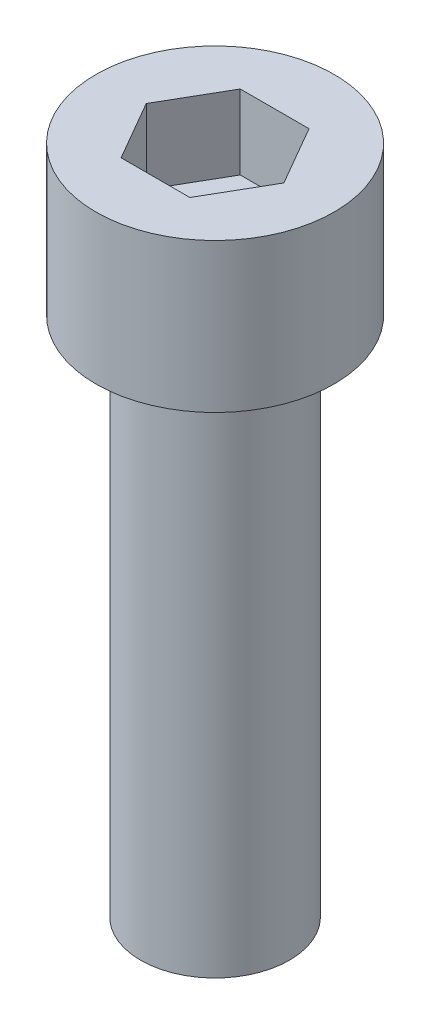
ISO-10303-21;
HEADER;
FILE_DESCRIPTION(('STEP AP214'),'2;1');
FILE_NAME('part.step','',(''),(''),'','','');
FILE_SCHEMA(('AUTOMOTIVE_DESIGN { 1 0 10303 214 1 1 1 1 }'));
ENDSEC;
DATA;
#1=APPLICATION_CONTEXT('core data for automotive mechanical design processes');
#2=APPLICATION_PROTOCOL_DEFINITION('international standard','automotive_design',2000,#1);
#3=PRODUCT_CONTEXT('',#1,'mechanical');
#4=PRODUCT('Part','Part','',(#3));
#5=PRODUCT_RELATED_PRODUCT_CATEGORY('part','',(#4));
#6=PRODUCT_DEFINITION_FORMATION('','',#4);
#7=PRODUCT_DEFINITION_CONTEXT('part definition',#1,'design');
#8=PRODUCT_DEFINITION('design','',#6,#7);
#9=PRODUCT_DEFINITION_SHAPE('','',#8);
#10=(LENGTH_UNIT() NAMED_UNIT(*) SI_UNIT(.MILLI.,.METRE.));
#11=(NAMED_UNIT(*) PLANE_ANGLE_UNIT() SI_UNIT($,.RADIAN.));
#12=(NAMED_UNIT(*) SI_UNIT($,.STERADIAN.) SOLID_ANGLE_UNIT());
#13=UNCERTAINTY_MEASURE_WITH_UNIT(LENGTH_MEASURE(1.E-05),#10,'distance_accuracy_value','');
#14=(GEOMETRIC_REPRESENTATION_CONTEXT(3) GLOBAL_UNCERTAINTY_ASSIGNED_CONTEXT((#13)) GLOBAL_UNIT_ASSIGNED_CONTEXT((#10,
#11,#12)) REPRESENTATION_CONTEXT('',''));
#15=CARTESIAN_POINT('',(0.,0.,0.));
#16=DIRECTION('',(0.,0.,1.));
#17=DIRECTION('',(1.,0.,0.));
#18=AXIS2_PLACEMENT_3D('',#15,#16,#17);
#19=CARTESIAN_POINT('',(8.00000000000001,10.,0.));
#20=DIRECTION('',(0.,-1.,0.));
#21=DIRECTION('',(0.,0.,-1.));
#22=AXIS2_PLACEMENT_3D('',#19,#20,#21);
#23=PLANE('',#22);
#24=DIRECTION('',(-1.,0.,0.));
#25=VECTOR('',#24,1.);
#26=CARTESIAN_POINT('',(2.3094010767585,10.,-4.));
#27=LINE('',#26,#25);
#28=CARTESIAN_POINT('',(2.3094010767585,10.,-4.));
#29=VERTEX_POINT('',#28);
#30=CARTESIAN_POINT('',(-2.3094010767585,10.,-4.));
#31=VERTEX_POINT('',#30);
#32=EDGE_CURVE('E122',#29,#31,#27,.T.);
#33=ORIENTED_EDGE('',*,*,#32,.F.);
#34=DIRECTION('',(-0.5,0.,-0.866025403784439));
#35=VECTOR('',#34,1.);
#36=CARTESIAN_POINT('',(4.61880215351701,10.,0.));
#37=LINE('',#36,#35);
#38=CARTESIAN_POINT('',(4.61880215351701,10.,0.));
#39=VERTEX_POINT('',#38);
#40=EDGE_CURVE('E48',#39,#29,#37,.T.);
#41=ORIENTED_EDGE('',*,*,#40,.F.);
#42=DIRECTION('',(0.5,0.,-0.866025403784439));
#43=VECTOR('',#42,1.);
#44=CARTESIAN_POINT('',(2.3094010767585,10.,4.));
#45=LINE('',#44,#43);
#46=CARTESIAN_POINT('',(2.3094010767585,10.,4.));
#47=VERTEX_POINT('',#46);
#48=EDGE_CURVE('E131',#47,#39,#45,.T.);
#49=ORIENTED_EDGE('',*,*,#48,.F.);
#50=DIRECTION('',(1.,0.,0.));
#51=VECTOR('',#50,1.);
#52=CARTESIAN_POINT('',(-2.3094010767585,10.,4.));
#53=LINE('',#52,#51);
#54=CARTESIAN_POINT('',(-2.3094010767585,10.,4.));
#55=VERTEX_POINT('',#54);
#56=EDGE_CURVE('E129',#55,#47,#53,.T.);
#57=ORIENTED_EDGE('',*,*,#56,.F.);
#58=DIRECTION('',(0.5,0.,0.866025403784438));
#59=VECTOR('',#58,1.);
#60=CARTESIAN_POINT('',(-4.61880215351701,10.,0.));
#61=LINE('',#60,#59);
#62=CARTESIAN_POINT('',(-4.61880215351701,10.,0.));
#63=VERTEX_POINT('',#62);
#64=EDGE_CURVE('E96',#63,#55,#61,.T.);
#65=ORIENTED_EDGE('',*,*,#64,.F.);
#66=DIRECTION('',(-0.5,0.,0.866025403784439));
#67=VECTOR('',#66,1.);
#68=CARTESIAN_POINT('',(-2.3094010767585,10.,-4.));
#69=LINE('',#68,#67);
#70=EDGE_CURVE('E125',#31,#63,#69,.T.);
#71=ORIENTED_EDGE('',*,*,#70,.F.);
#72=EDGE_LOOP('',(#33,#41,#49,#57,#65,#71));
#73=FACE_BOUND('',#72,.T.);
#74=CARTESIAN_POINT('',(0.,10.,0.));
#75=DIRECTION('',(0.,1.,0.));
#76=DIRECTION('',(0.,0.,1.));
#77=AXIS2_PLACEMENT_3D('',#74,#75,#76);
#78=CIRCLE('',#77,8.00000000000001);
#79=CARTESIAN_POINT('',(0.,10.,8.00000000000001));
#80=VERTEX_POINT('',#79);
#81=EDGE_CURVE('E11',#80,#80,#78,.T.);
#82=ORIENTED_EDGE('',*,*,#81,.T.);
#83=EDGE_LOOP('',(#82));
#84=FACE_BOUND('',#83,.T.);
#85=ADVANCED_FACE('F34',(#73,#84),#23,.F.);
#86=CARTESIAN_POINT('',(0.,61.6916426261037,0.));
#87=DIRECTION('',(0.,1.,0.));
#88=DIRECTION('',(0.,0.,1.));
#89=AXIS2_PLACEMENT_3D('',#86,#87,#88);
#90=CYLINDRICAL_SURFACE('',#89,8.00000000000001);
#91=ORIENTED_EDGE('',*,*,#81,.F.);
#92=EDGE_LOOP('',(#91));
#93=FACE_BOUND('',#92,.T.);
#94=CARTESIAN_POINT('',(0.,0.,0.));
#95=DIRECTION('',(0.,1.,0.));
#96=DIRECTION('',(0.,0.,1.));
#97=AXIS2_PLACEMENT_3D('',#94,#95,#96);
#98=CIRCLE('',#97,8.00000000000001);
#99=CARTESIAN_POINT('',(0.,0.,8.00000000000001));
#100=VERTEX_POINT('',#99);
#101=EDGE_CURVE('E41',#100,#100,#98,.T.);
#102=ORIENTED_EDGE('',*,*,#101,.T.);
#103=EDGE_LOOP('',(#102));
#104=FACE_BOUND('',#103,.T.);
#105=ADVANCED_FACE('F148',(#93,#104),#90,.T.);
#106=CARTESIAN_POINT('',(5.00000000000001,0.,0.));
#107=DIRECTION('',(0.,1.,0.));
#108=DIRECTION('',(0.,0.,1.));
#109=AXIS2_PLACEMENT_3D('',#106,#107,#108);
#110=PLANE('',#109);
#111=ORIENTED_EDGE('',*,*,#101,.F.);
#112=EDGE_LOOP('',(#111));
#113=FACE_BOUND('',#112,.T.);
#114=CARTESIAN_POINT('',(0.,0.,0.));
#115=DIRECTION('',(0.,1.,0.));
#116=DIRECTION('',(0.,0.,1.));
#117=AXIS2_PLACEMENT_3D('',#114,#115,#116);
#118=CIRCLE('',#117,5.00000000000001);
#119=CARTESIAN_POINT('',(0.,0.,5.00000000000001));
#120=VERTEX_POINT('',#119);
#121=EDGE_CURVE('E143',#120,#120,#118,.T.);
#122=ORIENTED_EDGE('',*,*,#121,.T.);
#123=EDGE_LOOP('',(#122));
#124=FACE_BOUND('',#123,.T.);
#125=ADVANCED_FACE('F150',(#113,#124),#110,.F.);
#126=CARTESIAN_POINT('',(0.,61.6916426261037,0.));
#127=DIRECTION('',(0.,1.,0.));
#128=DIRECTION('',(0.,0.,1.));
#129=AXIS2_PLACEMENT_3D('',#126,#127,#128);
#130=CYLINDRICAL_SURFACE('',#129,5.00000000000001);
#131=ORIENTED_EDGE('',*,*,#121,.F.);
#132=EDGE_LOOP('',(#131));
#133=FACE_BOUND('',#132,.T.);
#134=CARTESIAN_POINT('',(0.,-35.,0.));
#135=DIRECTION('',(0.,1.,0.));
#136=DIRECTION('',(0.,0.,1.));
#137=AXIS2_PLACEMENT_3D('',#134,#135,#136);
#138=CIRCLE('',#137,5.00000000000001);
#139=CARTESIAN_POINT('',(0.,-35.,5.00000000000001));
#140=VERTEX_POINT('',#139);
#141=EDGE_CURVE('E135',#140,#140,#138,.T.);
#142=ORIENTED_EDGE('',*,*,#141,.T.);
#143=EDGE_LOOP('',(#142));
#144=FACE_BOUND('',#143,.T.);
#145=ADVANCED_FACE('F153',(#133,#144),#130,.T.);
#146=CARTESIAN_POINT('',(0.,-35.,0.));
#147=DIRECTION('',(0.,1.,0.));
#148=DIRECTION('',(0.,0.,1.));
#149=AXIS2_PLACEMENT_3D('',#146,#147,#148);
#150=PLANE('',#149);
#151=ORIENTED_EDGE('',*,*,#141,.F.);
#152=EDGE_LOOP('',(#151));
#153=FACE_BOUND('',#152,.T.);
#154=ADVANCED_FACE('F159',(#153),#150,.F.);
#155=CARTESIAN_POINT('',(4.61880215351701,5.,0.));
#156=DIRECTION('',(0.866025403784439,0.,-0.5));
#157=DIRECTION('',(-0.5,0.,-0.866025403784439));
#158=AXIS2_PLACEMENT_3D('',#155,#156,#157);
#159=PLANE('',#158);
#160=ORIENTED_EDGE('',*,*,#40,.T.);
#161=DIRECTION('',(0.,1.,0.));
#162=VECTOR('',#161,1.);
#163=CARTESIAN_POINT('',(2.3094010767585,5.,-4.));
#164=LINE('',#163,#162);
#165=CARTESIAN_POINT('',(2.3094010767585,5.,-4.));
#166=VERTEX_POINT('',#165);
#167=EDGE_CURVE('E78',#166,#29,#164,.T.);
#168=ORIENTED_EDGE('',*,*,#167,.F.);
#169=DIRECTION('',(-0.5,0.,-0.866025403784439));
#170=VECTOR('',#169,1.);
#171=CARTESIAN_POINT('',(4.61880215351701,5.,0.));
#172=LINE('',#171,#170);
#173=CARTESIAN_POINT('',(4.61880215351701,5.,0.));
#174=VERTEX_POINT('',#173);
#175=EDGE_CURVE('E133',#174,#166,#172,.T.);
#176=ORIENTED_EDGE('',*,*,#175,.F.);
#177=DIRECTION('',(0.,1.,0.));
#178=VECTOR('',#177,1.);
#179=CARTESIAN_POINT('',(4.61880215351701,5.,0.));
#180=LINE('',#179,#178);
#181=EDGE_CURVE('E56',#174,#39,#180,.T.);
#182=ORIENTED_EDGE('',*,*,#181,.T.);
#183=EDGE_LOOP('',(#160,#168,#176,#182));
#184=FACE_BOUND('',#183,.T.);
#185=ADVANCED_FACE('F164',(#184),#159,.F.);
#186=CARTESIAN_POINT('',(2.3094010767585,5.,4.));
#187=DIRECTION('',(0.866025403784439,0.,0.5));
#188=DIRECTION('',(0.5,0.,-0.866025403784439));
#189=AXIS2_PLACEMENT_3D('',#186,#187,#188);
#190=PLANE('',#189);
#191=ORIENTED_EDGE('',*,*,#48,.T.);
#192=ORIENTED_EDGE('',*,*,#181,.F.);
#193=DIRECTION('',(0.5,0.,-0.866025403784439));
#194=VECTOR('',#193,1.);
#195=CARTESIAN_POINT('',(2.3094010767585,5.,4.));
#196=LINE('',#195,#194);
#197=CARTESIAN_POINT('',(2.3094010767585,5.,4.));
#198=VERTEX_POINT('',#197);
#199=EDGE_CURVE('E108',#198,#174,#196,.T.);
#200=ORIENTED_EDGE('',*,*,#199,.F.);
#201=DIRECTION('',(0.,1.,0.));
#202=VECTOR('',#201,1.);
#203=CARTESIAN_POINT('',(2.3094010767585,5.,4.));
#204=LINE('',#203,#202);
#205=EDGE_CURVE('E100',#198,#47,#204,.T.);
#206=ORIENTED_EDGE('',*,*,#205,.T.);
#207=EDGE_LOOP('',(#191,#192,#200,#206));
#208=FACE_BOUND('',#207,.T.);
#209=ADVANCED_FACE('F169',(#208),#190,.F.);
#210=CARTESIAN_POINT('',(-2.3094010767585,5.,4.));
#211=DIRECTION('',(0.,0.,1.));
#212=DIRECTION('',(1.,0.,0.));
#213=AXIS2_PLACEMENT_3D('',#210,#211,#212);
#214=PLANE('',#213);
#215=ORIENTED_EDGE('',*,*,#56,.T.);
#216=ORIENTED_EDGE('',*,*,#205,.F.);
#217=DIRECTION('',(1.,0.,0.));
#218=VECTOR('',#217,1.);
#219=CARTESIAN_POINT('',(-2.3094010767585,5.,4.));
#220=LINE('',#219,#218);
#221=CARTESIAN_POINT('',(-2.3094010767585,5.,4.));
#222=VERTEX_POINT('',#221);
#223=EDGE_CURVE('E104',#222,#198,#220,.T.);
#224=ORIENTED_EDGE('',*,*,#223,.F.);
#225=DIRECTION('',(0.,1.,0.));
#226=VECTOR('',#225,1.);
#227=CARTESIAN_POINT('',(-2.3094010767585,5.,4.));
#228=LINE('',#227,#226);
#229=EDGE_CURVE('E89',#222,#55,#228,.T.);
#230=ORIENTED_EDGE('',*,*,#229,.T.);
#231=EDGE_LOOP('',(#215,#216,#224,#230));
#232=FACE_BOUND('',#231,.T.);
#233=ADVANCED_FACE('F105',(#232),#214,.F.);
#234=CARTESIAN_POINT('',(-4.61880215351701,5.,0.));
#235=DIRECTION('',(-0.866025403784438,0.,0.5));
#236=DIRECTION('',(0.5,0.,0.866025403784439));
#237=AXIS2_PLACEMENT_3D('',#234,#235,#236);
#238=PLANE('',#237);
#239=ORIENTED_EDGE('',*,*,#64,.T.);
#240=ORIENTED_EDGE('',*,*,#229,.F.);
#241=DIRECTION('',(0.5,0.,0.866025403784438));
#242=VECTOR('',#241,1.);
#243=CARTESIAN_POINT('',(-4.61880215351701,5.,0.));
#244=LINE('',#243,#242);
#245=CARTESIAN_POINT('',(-4.61880215351701,5.,0.));
#246=VERTEX_POINT('',#245);
#247=EDGE_CURVE('E93',#246,#222,#244,.T.);
#248=ORIENTED_EDGE('',*,*,#247,.F.);
#249=DIRECTION('',(0.,1.,0.));
#250=VECTOR('',#249,1.);
#251=CARTESIAN_POINT('',(-4.61880215351701,5.,0.));
#252=LINE('',#251,#250);
#253=EDGE_CURVE('E101',#246,#63,#252,.T.);
#254=ORIENTED_EDGE('',*,*,#253,.T.);
#255=EDGE_LOOP('',(#239,#240,#248,#254));
#256=FACE_BOUND('',#255,.T.);
#257=ADVANCED_FACE('F91',(#256),#238,.F.);
#258=CARTESIAN_POINT('',(-2.3094010767585,5.,-4.));
#259=DIRECTION('',(-0.866025403784439,0.,-0.5));
#260=DIRECTION('',(-0.5,0.,0.866025403784439));
#261=AXIS2_PLACEMENT_3D('',#258,#259,#260);
#262=PLANE('',#261);
#263=ORIENTED_EDGE('',*,*,#70,.T.);
#264=ORIENTED_EDGE('',*,*,#253,.F.);
#265=DIRECTION('',(-0.5,0.,0.866025403784439));
#266=VECTOR('',#265,1.);
#267=CARTESIAN_POINT('',(-2.3094010767585,5.,-4.));
#268=LINE('',#267,#266);
#269=CARTESIAN_POINT('',(-2.3094010767585,5.,-4.));
#270=VERTEX_POINT('',#269);
#271=EDGE_CURVE('E114',#270,#246,#268,.T.);
#272=ORIENTED_EDGE('',*,*,#271,.F.);
#273=DIRECTION('',(0.,1.,0.));
#274=VECTOR('',#273,1.);
#275=CARTESIAN_POINT('',(-2.3094010767585,5.,-4.));
#276=LINE('',#275,#274);
#277=EDGE_CURVE('E138',#270,#31,#276,.T.);
#278=ORIENTED_EDGE('',*,*,#277,.T.);
#279=EDGE_LOOP('',(#263,#264,#272,#278));
#280=FACE_BOUND('',#279,.T.);
#281=ADVANCED_FACE('F195',(#280),#262,.F.);
#282=CARTESIAN_POINT('',(2.3094010767585,5.,-4.));
#283=DIRECTION('',(0.,0.,-1.));
#284=DIRECTION('',(-1.,0.,0.));
#285=AXIS2_PLACEMENT_3D('',#282,#283,#284);
#286=PLANE('',#285);
#287=ORIENTED_EDGE('',*,*,#32,.T.);
#288=ORIENTED_EDGE('',*,*,#277,.F.);
#289=DIRECTION('',(-1.,0.,0.));
#290=VECTOR('',#289,1.);
#291=CARTESIAN_POINT('',(2.3094010767585,5.,-4.));
#292=LINE('',#291,#290);
#293=EDGE_CURVE('E116',#166,#270,#292,.T.);
#294=ORIENTED_EDGE('',*,*,#293,.F.);
#295=ORIENTED_EDGE('',*,*,#167,.T.);
#296=EDGE_LOOP('',(#287,#288,#294,#295));
#297=FACE_BOUND('',#296,.T.);
#298=ADVANCED_FACE('F183',(#297),#286,.F.);
#299=CARTESIAN_POINT('',(0.,5.,-8.));
#300=DIRECTION('',(0.,1.,0.));
#301=DIRECTION('',(0.,0.,1.));
#302=AXIS2_PLACEMENT_3D('',#299,#300,#301);
#303=PLANE('',#302);
#304=ORIENTED_EDGE('',*,*,#175,.T.);
#305=ORIENTED_EDGE('',*,*,#293,.T.);
#306=ORIENTED_EDGE('',*,*,#271,.T.);
#307=ORIENTED_EDGE('',*,*,#247,.T.);
#308=ORIENTED_EDGE('',*,*,#223,.T.);
#309=ORIENTED_EDGE('',*,*,#199,.T.);
#310=EDGE_LOOP('',(#304,#305,#306,#307,#308,#309));
#311=FACE_BOUND('',#310,.T.);
#312=ADVANCED_FACE('F111',(#311),#303,.T.);
#313=CLOSED_SHELL('',(#85,#105,#125,#145,#154,#185,#209,#233,#257,#281,#298,#312));
#314=MANIFOLD_SOLID_BREP('B2',#313);
#315=ADVANCED_BREP_SHAPE_REPRESENTATION('',(#18,#314),#14);
#316=SHAPE_DEFINITION_REPRESENTATION(#9,#315);
ENDSEC;
END-ISO-10303-21;
